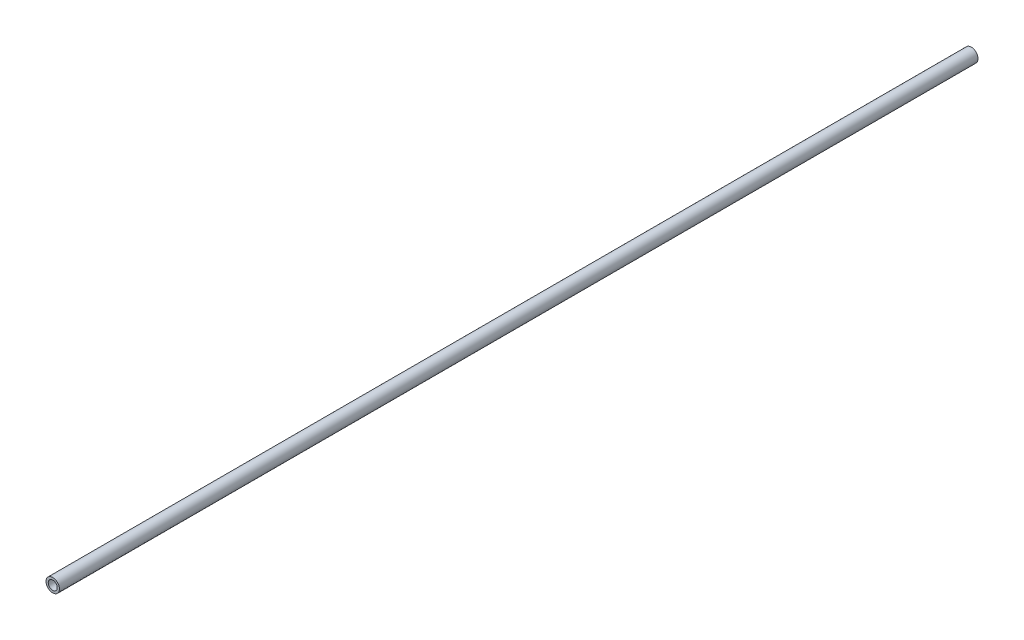
ISO-10303-21;
HEADER;
FILE_DESCRIPTION(('STEP AP214'),'2;1');
FILE_NAME('part.step','',(''),(''),'','','');
FILE_SCHEMA(('AUTOMOTIVE_DESIGN { 1 0 10303 214 1 1 1 1 }'));
ENDSEC;
DATA;
#1=APPLICATION_CONTEXT('core data for automotive mechanical design processes');
#2=APPLICATION_PROTOCOL_DEFINITION('international standard','automotive_design',2000,#1);
#3=PRODUCT_CONTEXT('',#1,'mechanical');
#4=PRODUCT('Part','Part','',(#3));
#5=PRODUCT_RELATED_PRODUCT_CATEGORY('part','',(#4));
#6=PRODUCT_DEFINITION_FORMATION('','',#4);
#7=PRODUCT_DEFINITION_CONTEXT('part definition',#1,'design');
#8=PRODUCT_DEFINITION('design','',#6,#7);
#9=PRODUCT_DEFINITION_SHAPE('','',#8);
#10=(LENGTH_UNIT() NAMED_UNIT(*) SI_UNIT(.MILLI.,.METRE.));
#11=(NAMED_UNIT(*) PLANE_ANGLE_UNIT() SI_UNIT($,.RADIAN.));
#12=(NAMED_UNIT(*) SI_UNIT($,.STERADIAN.) SOLID_ANGLE_UNIT());
#13=UNCERTAINTY_MEASURE_WITH_UNIT(LENGTH_MEASURE(1.E-05),#10,'distance_accuracy_value','');
#14=(GEOMETRIC_REPRESENTATION_CONTEXT(3) GLOBAL_UNCERTAINTY_ASSIGNED_CONTEXT((#13)) GLOBAL_UNIT_ASSIGNED_CONTEXT((#10,
#11,#12)) REPRESENTATION_CONTEXT('',''));
#15=CARTESIAN_POINT('',(0.,0.,0.));
#16=DIRECTION('',(0.,0.,1.));
#17=DIRECTION('',(1.,0.,0.));
#18=AXIS2_PLACEMENT_3D('',#15,#16,#17);
#19=CARTESIAN_POINT('',(0.,0.,205.));
#20=DIRECTION('',(0.,0.,1.));
#21=DIRECTION('',(1.,0.,0.));
#22=AXIS2_PLACEMENT_3D('',#19,#20,#21);
#23=PLANE('',#22);
#24=CARTESIAN_POINT('',(0.,0.,205.));
#25=DIRECTION('',(0.,0.,1.));
#26=DIRECTION('',(1.,0.,0.));
#27=AXIS2_PLACEMENT_3D('',#24,#25,#26);
#28=CIRCLE('',#27,3.);
#29=CARTESIAN_POINT('',(-3.,0.,205.));
#30=VERTEX_POINT('',#29);
#31=EDGE_CURVE('E10',#30,#30,#28,.T.);
#32=ORIENTED_EDGE('',*,*,#31,.T.);
#33=EDGE_LOOP('',(#32));
#34=FACE_BOUND('',#33,.T.);
#35=CARTESIAN_POINT('',(0.,0.,205.));
#36=DIRECTION('',(0.,0.,1.));
#37=DIRECTION('',(1.,0.,0.));
#38=AXIS2_PLACEMENT_3D('',#35,#36,#37);
#39=CIRCLE('',#38,2.);
#40=CARTESIAN_POINT('',(-2.,0.,205.));
#41=VERTEX_POINT('',#40);
#42=EDGE_CURVE('E44',#41,#41,#39,.T.);
#43=ORIENTED_EDGE('',*,*,#42,.F.);
#44=EDGE_LOOP('',(#43));
#45=FACE_BOUND('',#44,.T.);
#46=ADVANCED_FACE('F33',(#34,#45),#23,.T.);
#47=CARTESIAN_POINT('',(0.,0.,-205.));
#48=DIRECTION('',(0.,0.,1.));
#49=DIRECTION('',(1.,0.,0.));
#50=AXIS2_PLACEMENT_3D('',#47,#48,#49);
#51=PLANE('',#50);
#52=CARTESIAN_POINT('',(0.,0.,-205.));
#53=DIRECTION('',(0.,0.,1.));
#54=DIRECTION('',(1.,0.,0.));
#55=AXIS2_PLACEMENT_3D('',#52,#53,#54);
#56=CIRCLE('',#55,3.);
#57=CARTESIAN_POINT('',(-3.,0.,-205.));
#58=VERTEX_POINT('',#57);
#59=EDGE_CURVE('E37',#58,#58,#56,.T.);
#60=ORIENTED_EDGE('',*,*,#59,.F.);
#61=EDGE_LOOP('',(#60));
#62=FACE_BOUND('',#61,.T.);
#63=CARTESIAN_POINT('',(0.,0.,-205.));
#64=DIRECTION('',(0.,0.,1.));
#65=DIRECTION('',(1.,0.,0.));
#66=AXIS2_PLACEMENT_3D('',#63,#64,#65);
#67=CIRCLE('',#66,2.);
#68=CARTESIAN_POINT('',(-2.,0.,-205.));
#69=VERTEX_POINT('',#68);
#70=EDGE_CURVE('E46',#69,#69,#67,.T.);
#71=ORIENTED_EDGE('',*,*,#70,.T.);
#72=EDGE_LOOP('',(#71));
#73=FACE_BOUND('',#72,.T.);
#74=ADVANCED_FACE('F56',(#62,#73),#51,.F.);
#75=CARTESIAN_POINT('',(0.,0.,205.));
#76=DIRECTION('',(0.,0.,-1.));
#77=DIRECTION('',(-1.,0.,0.));
#78=AXIS2_PLACEMENT_3D('',#75,#76,#77);
#79=CYLINDRICAL_SURFACE('',#78,3.);
#80=CARTESIAN_POINT('',(-3.,0.,205.));
#81=CARTESIAN_POINT('',(-3.,0.,200.729166666667));
#82=CARTESIAN_POINT('',(-3.,0.,196.458333333333));
#83=CARTESIAN_POINT('',(-3.,0.,187.916666666667));
#84=CARTESIAN_POINT('',(-3.,0.,183.645833333333));
#85=CARTESIAN_POINT('',(-3.,0.,175.104166666667));
#86=CARTESIAN_POINT('',(-3.,0.,170.833333333333));
#87=CARTESIAN_POINT('',(-3.,0.,162.291666666667));
#88=CARTESIAN_POINT('',(-3.,0.,158.020833333333));
#89=CARTESIAN_POINT('',(-3.,0.,149.479166666667));
#90=CARTESIAN_POINT('',(-3.,0.,145.208333333333));
#91=CARTESIAN_POINT('',(-3.,0.,136.666666666667));
#92=CARTESIAN_POINT('',(-3.,0.,132.395833333333));
#93=CARTESIAN_POINT('',(-3.,0.,123.854166666667));
#94=CARTESIAN_POINT('',(-3.,0.,119.583333333333));
#95=CARTESIAN_POINT('',(-3.,0.,111.041666666667));
#96=CARTESIAN_POINT('',(-3.,0.,106.770833333333));
#97=CARTESIAN_POINT('',(-3.,0.,98.2291666666666));
#98=CARTESIAN_POINT('',(-3.,0.,93.9583333333333));
#99=CARTESIAN_POINT('',(-3.,0.,85.4166666666666));
#100=CARTESIAN_POINT('',(-3.,0.,81.1458333333333));
#101=CARTESIAN_POINT('',(-3.,0.,72.6041666666666));
#102=CARTESIAN_POINT('',(-3.,0.,68.3333333333333));
#103=CARTESIAN_POINT('',(-3.,0.,59.7916666666666));
#104=CARTESIAN_POINT('',(-3.,0.,55.5208333333333));
#105=CARTESIAN_POINT('',(-3.,0.,46.9791666666667));
#106=CARTESIAN_POINT('',(-3.,0.,42.7083333333333));
#107=CARTESIAN_POINT('',(-3.,0.,34.1666666666667));
#108=CARTESIAN_POINT('',(-3.,0.,29.8958333333333));
#109=CARTESIAN_POINT('',(-3.,0.,21.3541666666666));
#110=CARTESIAN_POINT('',(-3.,0.,17.0833333333333));
#111=CARTESIAN_POINT('',(-3.,0.,8.54166666666664));
#112=CARTESIAN_POINT('',(-3.,0.,4.27083333333331));
#113=CARTESIAN_POINT('',(-3.,0.,-4.27083333333336));
#114=CARTESIAN_POINT('',(-3.,0.,-8.5416666666667));
#115=CARTESIAN_POINT('',(-3.,0.,-17.0833333333334));
#116=CARTESIAN_POINT('',(-3.,0.,-21.3541666666667));
#117=CARTESIAN_POINT('',(-3.,0.,-29.8958333333334));
#118=CARTESIAN_POINT('',(-3.,0.,-34.1666666666667));
#119=CARTESIAN_POINT('',(-3.,0.,-42.7083333333334));
#120=CARTESIAN_POINT('',(-3.,0.,-46.9791666666667));
#121=CARTESIAN_POINT('',(-3.,0.,-55.5208333333333));
#122=CARTESIAN_POINT('',(-3.,0.,-59.7916666666667));
#123=CARTESIAN_POINT('',(-3.,0.,-68.3333333333333));
#124=CARTESIAN_POINT('',(-3.,0.,-72.6041666666667));
#125=CARTESIAN_POINT('',(-3.,0.,-81.1458333333333));
#126=CARTESIAN_POINT('',(-3.,0.,-85.4166666666667));
#127=CARTESIAN_POINT('',(-3.,0.,-93.9583333333333));
#128=CARTESIAN_POINT('',(-3.,0.,-98.2291666666666));
#129=CARTESIAN_POINT('',(-3.,0.,-106.770833333333));
#130=CARTESIAN_POINT('',(-3.,0.,-111.041666666667));
#131=CARTESIAN_POINT('',(-3.,0.,-119.583333333333));
#132=CARTESIAN_POINT('',(-3.,0.,-123.854166666667));
#133=CARTESIAN_POINT('',(-3.,0.,-132.395833333333));
#134=CARTESIAN_POINT('',(-3.,0.,-136.666666666667));
#135=CARTESIAN_POINT('',(-3.,0.,-145.208333333333));
#136=CARTESIAN_POINT('',(-3.,0.,-149.479166666667));
#137=CARTESIAN_POINT('',(-3.,0.,-158.020833333333));
#138=CARTESIAN_POINT('',(-3.,0.,-162.291666666667));
#139=CARTESIAN_POINT('',(-3.,0.,-170.833333333333));
#140=CARTESIAN_POINT('',(-3.,0.,-175.104166666667));
#141=CARTESIAN_POINT('',(-3.,0.,-183.645833333333));
#142=CARTESIAN_POINT('',(-3.,0.,-187.916666666667));
#143=CARTESIAN_POINT('',(-3.,0.,-196.458333333333));
#144=CARTESIAN_POINT('',(-3.,0.,-200.729166666667));
#145=CARTESIAN_POINT('',(-3.,0.,-205.));
#146=B_SPLINE_CURVE_WITH_KNOTS('',3,(#80,#81,#82,#83,#84,#85,#86,#87,#88,#89,#90,#91,#92,#93,
#94,#95,#96,#97,#98,#99,#100,#101,#102,#103,#104,#105,#106,#107,#108,#109,#110,#111,#112,#113,
#114,#115,#116,#117,#118,#119,#120,#121,#122,#123,#124,#125,#126,#127,#128,#129,#130,#131,#132,
#133,#134,#135,#136,#137,#138,#139,#140,#141,#142,#143,#144,#145),.UNSPECIFIED.,.F.,.F.,(4,2,2,
2,2,2,2,2,2,2,2,2,2,2,2,2,2,2,2,2,2,2,2,2,2,2,2,2,2,2,2,2,4),(0.,12.8125,25.625,38.4375,51.25,
64.0625,76.875,89.6875,102.5,115.3125,128.125,140.9375,153.75,166.5625,179.375,192.1875,205.,
217.8125,230.625,243.4375,256.25,269.0625,281.875,294.6875,307.5,320.3125,333.125,345.9375,
358.75,371.5625,384.375,397.1875,410.),.UNSPECIFIED.);
#147=EDGE_CURVE('BSEAM35',#30,#58,#146,.T.);
#148=ORIENTED_EDGE('',*,*,#31,.F.);
#149=ORIENTED_EDGE('',*,*,#59,.T.);
#150=ORIENTED_EDGE('',*,*,#147,.T.);
#151=ORIENTED_EDGE('',*,*,#147,.F.);
#152=EDGE_LOOP('',(#148,#150,#149,#151));
#153=FACE_BOUND('',#152,.T.);
#154=ADVANCED_FACE('F35',(#153),#79,.T.);
#155=CARTESIAN_POINT('',(0.,0.,205.));
#156=DIRECTION('',(0.,0.,-1.));
#157=DIRECTION('',(-1.,0.,0.));
#158=AXIS2_PLACEMENT_3D('',#155,#156,#157);
#159=CYLINDRICAL_SURFACE('',#158,2.);
#160=CARTESIAN_POINT('',(-2.,0.,205.));
#161=CARTESIAN_POINT('',(-2.,0.,200.729166666667));
#162=CARTESIAN_POINT('',(-2.,0.,196.458333333333));
#163=CARTESIAN_POINT('',(-2.,0.,187.916666666667));
#164=CARTESIAN_POINT('',(-2.,0.,183.645833333333));
#165=CARTESIAN_POINT('',(-2.,0.,175.104166666667));
#166=CARTESIAN_POINT('',(-2.,0.,170.833333333333));
#167=CARTESIAN_POINT('',(-2.,0.,162.291666666667));
#168=CARTESIAN_POINT('',(-2.,0.,158.020833333333));
#169=CARTESIAN_POINT('',(-2.,0.,149.479166666667));
#170=CARTESIAN_POINT('',(-2.,0.,145.208333333333));
#171=CARTESIAN_POINT('',(-2.,0.,136.666666666667));
#172=CARTESIAN_POINT('',(-2.,0.,132.395833333333));
#173=CARTESIAN_POINT('',(-2.,0.,123.854166666667));
#174=CARTESIAN_POINT('',(-2.,0.,119.583333333333));
#175=CARTESIAN_POINT('',(-2.,0.,111.041666666667));
#176=CARTESIAN_POINT('',(-2.,0.,106.770833333333));
#177=CARTESIAN_POINT('',(-2.,0.,98.2291666666666));
#178=CARTESIAN_POINT('',(-2.,0.,93.9583333333333));
#179=CARTESIAN_POINT('',(-2.,0.,85.4166666666667));
#180=CARTESIAN_POINT('',(-2.,0.,81.1458333333333));
#181=CARTESIAN_POINT('',(-2.,0.,72.6041666666667));
#182=CARTESIAN_POINT('',(-2.,0.,68.3333333333333));
#183=CARTESIAN_POINT('',(-2.,0.,59.7916666666667));
#184=CARTESIAN_POINT('',(-2.,0.,55.5208333333333));
#185=CARTESIAN_POINT('',(-2.,0.,46.9791666666667));
#186=CARTESIAN_POINT('',(-2.,0.,42.7083333333333));
#187=CARTESIAN_POINT('',(-2.,0.,34.1666666666667));
#188=CARTESIAN_POINT('',(-2.,0.,29.8958333333333));
#189=CARTESIAN_POINT('',(-2.,0.,21.3541666666667));
#190=CARTESIAN_POINT('',(-2.,0.,17.0833333333333));
#191=CARTESIAN_POINT('',(-2.,0.,8.54166666666667));
#192=CARTESIAN_POINT('',(-2.,0.,4.27083333333333));
#193=CARTESIAN_POINT('',(-2.,0.,-4.27083333333333));
#194=CARTESIAN_POINT('',(-2.,0.,-8.54166666666667));
#195=CARTESIAN_POINT('',(-2.,0.,-17.0833333333333));
#196=CARTESIAN_POINT('',(-2.,0.,-21.3541666666667));
#197=CARTESIAN_POINT('',(-2.,0.,-29.8958333333333));
#198=CARTESIAN_POINT('',(-2.,0.,-34.1666666666667));
#199=CARTESIAN_POINT('',(-2.,0.,-42.7083333333333));
#200=CARTESIAN_POINT('',(-2.,0.,-46.9791666666667));
#201=CARTESIAN_POINT('',(-2.,0.,-55.5208333333333));
#202=CARTESIAN_POINT('',(-2.,0.,-59.7916666666667));
#203=CARTESIAN_POINT('',(-2.,0.,-68.3333333333333));
#204=CARTESIAN_POINT('',(-2.,0.,-72.6041666666667));
#205=CARTESIAN_POINT('',(-2.,0.,-81.1458333333333));
#206=CARTESIAN_POINT('',(-2.,0.,-85.4166666666667));
#207=CARTESIAN_POINT('',(-2.,0.,-93.9583333333333));
#208=CARTESIAN_POINT('',(-2.,0.,-98.2291666666666));
#209=CARTESIAN_POINT('',(-2.,0.,-106.770833333333));
#210=CARTESIAN_POINT('',(-2.,0.,-111.041666666667));
#211=CARTESIAN_POINT('',(-2.,0.,-119.583333333333));
#212=CARTESIAN_POINT('',(-2.,0.,-123.854166666667));
#213=CARTESIAN_POINT('',(-2.,0.,-132.395833333333));
#214=CARTESIAN_POINT('',(-2.,0.,-136.666666666667));
#215=CARTESIAN_POINT('',(-2.,0.,-145.208333333333));
#216=CARTESIAN_POINT('',(-2.,0.,-149.479166666667));
#217=CARTESIAN_POINT('',(-2.,0.,-158.020833333333));
#218=CARTESIAN_POINT('',(-2.,0.,-162.291666666667));
#219=CARTESIAN_POINT('',(-2.,0.,-170.833333333333));
#220=CARTESIAN_POINT('',(-2.,0.,-175.104166666667));
#221=CARTESIAN_POINT('',(-2.,0.,-183.645833333333));
#222=CARTESIAN_POINT('',(-2.,0.,-187.916666666667));
#223=CARTESIAN_POINT('',(-2.,0.,-196.458333333333));
#224=CARTESIAN_POINT('',(-2.,0.,-200.729166666667));
#225=CARTESIAN_POINT('',(-2.,0.,-205.));
#226=B_SPLINE_CURVE_WITH_KNOTS('',3,(#160,#161,#162,#163,#164,#165,#166,#167,#168,#169,#170,
#171,#172,#173,#174,#175,#176,#177,#178,#179,#180,#181,#182,#183,#184,#185,#186,#187,#188,#189,
#190,#191,#192,#193,#194,#195,#196,#197,#198,#199,#200,#201,#202,#203,#204,#205,#206,#207,#208,
#209,#210,#211,#212,#213,#214,#215,#216,#217,#218,#219,#220,#221,#222,#223,#224,#225),
.UNSPECIFIED.,.F.,.F.,(4,2,2,2,2,2,2,2,2,2,2,2,2,2,2,2,2,2,2,2,2,2,2,2,2,2,2,2,2,2,2,2,4),(0.,
12.8125,25.625,38.4375,51.25,64.0625,76.875,89.6875,102.5,115.3125,128.125,140.9375,153.75,
166.5625,179.375,192.1875,205.,217.8125,230.625,243.4375,256.25,269.0625,281.875,294.6875,307.5,
320.3125,333.125,345.9375,358.75,371.5625,384.375,397.1875,410.),.UNSPECIFIED.);
#227=EDGE_CURVE('BSEAM52',#41,#69,#226,.T.);
#228=ORIENTED_EDGE('',*,*,#42,.T.);
#229=ORIENTED_EDGE('',*,*,#70,.F.);
#230=ORIENTED_EDGE('',*,*,#227,.T.);
#231=ORIENTED_EDGE('',*,*,#227,.F.);
#232=EDGE_LOOP('',(#228,#230,#229,#231));
#233=FACE_BOUND('',#232,.T.);
#234=ADVANCED_FACE('F52',(#233),#159,.F.);
#235=CLOSED_SHELL('',(#46,#74,#154,#234));
#236=MANIFOLD_SOLID_BREP('B2',#235);
#237=ADVANCED_BREP_SHAPE_REPRESENTATION('',(#18,#236),#14);
#238=SHAPE_DEFINITION_REPRESENTATION(#9,#237);
ENDSEC;
END-ISO-10303-21;
